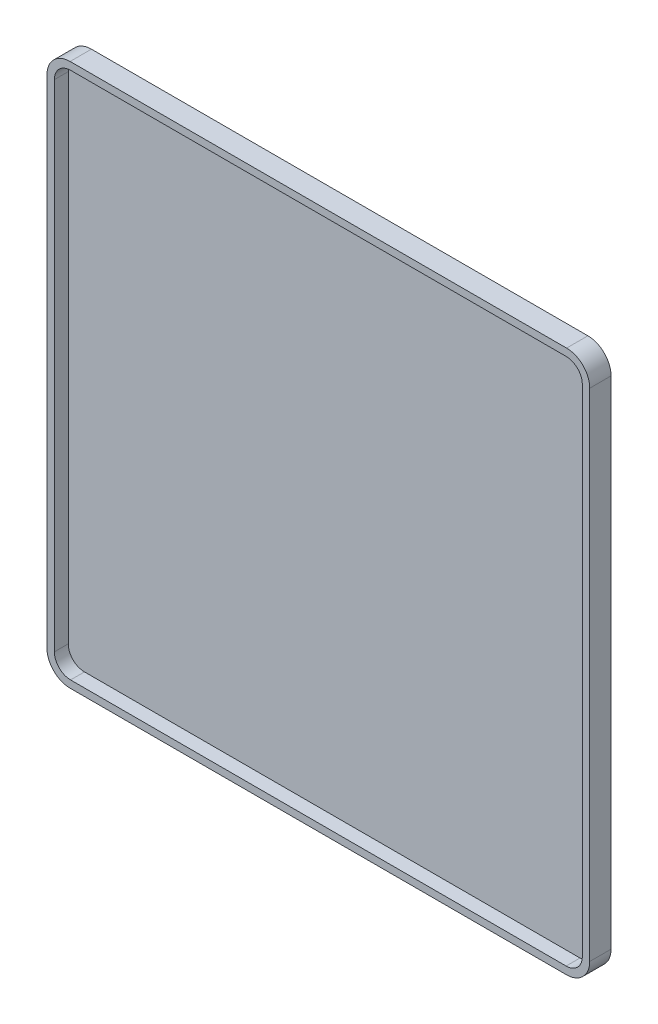
ISO-10303-21;
HEADER;
FILE_DESCRIPTION(('STEP AP214'),'2;1');
FILE_NAME('part.step','',(''),(''),'','','');
FILE_SCHEMA(('AUTOMOTIVE_DESIGN { 1 0 10303 214 1 1 1 1 }'));
ENDSEC;
DATA;
#1=APPLICATION_CONTEXT('core data for automotive mechanical design processes');
#2=APPLICATION_PROTOCOL_DEFINITION('international standard','automotive_design',2000,#1);
#3=PRODUCT_CONTEXT('',#1,'mechanical');
#4=PRODUCT('Part','Part','',(#3));
#5=PRODUCT_RELATED_PRODUCT_CATEGORY('part','',(#4));
#6=PRODUCT_DEFINITION_FORMATION('','',#4);
#7=PRODUCT_DEFINITION_CONTEXT('part definition',#1,'design');
#8=PRODUCT_DEFINITION('design','',#6,#7);
#9=PRODUCT_DEFINITION_SHAPE('','',#8);
#10=(LENGTH_UNIT() NAMED_UNIT(*) SI_UNIT(.MILLI.,.METRE.));
#11=(NAMED_UNIT(*) PLANE_ANGLE_UNIT() SI_UNIT($,.RADIAN.));
#12=(NAMED_UNIT(*) SI_UNIT($,.STERADIAN.) SOLID_ANGLE_UNIT());
#13=UNCERTAINTY_MEASURE_WITH_UNIT(LENGTH_MEASURE(1.E-05),#10,'distance_accuracy_value','');
#14=(GEOMETRIC_REPRESENTATION_CONTEXT(3) GLOBAL_UNCERTAINTY_ASSIGNED_CONTEXT((#13)) GLOBAL_UNIT_ASSIGNED_CONTEXT((#10,
#11,#12)) REPRESENTATION_CONTEXT('',''));
#15=CARTESIAN_POINT('',(0.,0.,0.));
#16=DIRECTION('',(0.,0.,1.));
#17=DIRECTION('',(1.,0.,0.));
#18=AXIS2_PLACEMENT_3D('',#15,#16,#17);
#19=CARTESIAN_POINT('',(-57.,-57.,3.));
#20=DIRECTION('',(0.,0.,-1.));
#21=DIRECTION('',(1.,0.,0.));
#22=AXIS2_PLACEMENT_3D('',#19,#20,#21);
#23=PLANE('',#22);
#24=DIRECTION('',(0.,1.,0.));
#25=VECTOR('',#24,1.);
#26=CARTESIAN_POINT('',(58.6,57.,3.));
#27=LINE('',#26,#25);
#28=CARTESIAN_POINT('',(58.6,-53.6,3.));
#29=VERTEX_POINT('',#28);
#30=CARTESIAN_POINT('',(58.6,53.6,3.));
#31=VERTEX_POINT('',#30);
#32=EDGE_CURVE('E149',#29,#31,#27,.T.);
#33=ORIENTED_EDGE('',*,*,#32,.T.);
#34=CARTESIAN_POINT('',(53.6,53.6,3.));
#35=DIRECTION('',(0.,0.,-1.));
#36=DIRECTION('',(-1.,0.,0.));
#37=AXIS2_PLACEMENT_3D('',#34,#35,#36);
#38=CIRCLE('',#37,5.);
#39=CARTESIAN_POINT('',(53.6,58.6,3.));
#40=VERTEX_POINT('',#39);
#41=EDGE_CURVE('E156',#31,#40,#38,.F.);
#42=ORIENTED_EDGE('',*,*,#41,.T.);
#43=DIRECTION('',(1.,0.,0.));
#44=VECTOR('',#43,1.);
#45=CARTESIAN_POINT('',(-57.,58.6,3.));
#46=LINE('',#45,#44);
#47=CARTESIAN_POINT('',(-53.6,58.6,3.));
#48=VERTEX_POINT('',#47);
#49=EDGE_CURVE('E167',#40,#48,#46,.F.);
#50=ORIENTED_EDGE('',*,*,#49,.T.);
#51=CARTESIAN_POINT('',(-53.6,53.6,3.));
#52=DIRECTION('',(0.,0.,-1.));
#53=DIRECTION('',(-1.,0.,0.));
#54=AXIS2_PLACEMENT_3D('',#51,#52,#53);
#55=CIRCLE('',#54,5.);
#56=CARTESIAN_POINT('',(-58.6,53.6,3.));
#57=VERTEX_POINT('',#56);
#58=EDGE_CURVE('E173',#48,#57,#55,.F.);
#59=ORIENTED_EDGE('',*,*,#58,.T.);
#60=DIRECTION('',(0.,-1.,0.));
#61=VECTOR('',#60,1.);
#62=CARTESIAN_POINT('',(-58.6,57.,3.));
#63=LINE('',#62,#61);
#64=CARTESIAN_POINT('',(-58.6,-53.6,3.));
#65=VERTEX_POINT('',#64);
#66=EDGE_CURVE('E275',#57,#65,#63,.T.);
#67=ORIENTED_EDGE('',*,*,#66,.T.);
#68=CARTESIAN_POINT('',(-53.6,-53.6,3.));
#69=DIRECTION('',(0.,0.,-1.));
#70=DIRECTION('',(-1.,0.,0.));
#71=AXIS2_PLACEMENT_3D('',#68,#69,#70);
#72=CIRCLE('',#71,5.);
#73=CARTESIAN_POINT('',(-53.6,-58.6,3.));
#74=VERTEX_POINT('',#73);
#75=EDGE_CURVE('E157',#65,#74,#72,.F.);
#76=ORIENTED_EDGE('',*,*,#75,.T.);
#77=DIRECTION('',(1.,0.,0.));
#78=VECTOR('',#77,1.);
#79=CARTESIAN_POINT('',(-57.,-58.6,3.));
#80=LINE('',#79,#78);
#81=CARTESIAN_POINT('',(53.6,-58.6,3.));
#82=VERTEX_POINT('',#81);
#83=EDGE_CURVE('E151',#74,#82,#80,.T.);
#84=ORIENTED_EDGE('',*,*,#83,.T.);
#85=CARTESIAN_POINT('',(53.6,-53.6,3.));
#86=DIRECTION('',(0.,0.,-1.));
#87=DIRECTION('',(-1.,0.,0.));
#88=AXIS2_PLACEMENT_3D('',#85,#86,#87);
#89=CIRCLE('',#88,5.);
#90=EDGE_CURVE('E147',#82,#29,#89,.F.);
#91=ORIENTED_EDGE('',*,*,#90,.T.);
#92=EDGE_LOOP('',(#33,#42,#50,#59,#67,#76,#84,#91));
#93=FACE_BOUND('',#92,.T.);
#94=DIRECTION('',(1.,0.,0.));
#95=VECTOR('',#94,1.);
#96=CARTESIAN_POINT('',(-57.,-57.,3.));
#97=LINE('',#96,#95);
#98=CARTESIAN_POINT('',(-53.5,-57.,3.));
#99=VERTEX_POINT('',#98);
#100=CARTESIAN_POINT('',(53.5,-57.,3.));
#101=VERTEX_POINT('',#100);
#102=EDGE_CURVE('E261',#99,#101,#97,.T.);
#103=ORIENTED_EDGE('',*,*,#102,.F.);
#104=CARTESIAN_POINT('',(-53.5,-53.5,3.));
#105=DIRECTION('',(0.,0.,-1.));
#106=DIRECTION('',(-1.,0.,0.));
#107=AXIS2_PLACEMENT_3D('',#104,#105,#106);
#108=CIRCLE('',#107,3.5);
#109=CARTESIAN_POINT('',(-57.,-53.5,3.));
#110=VERTEX_POINT('',#109);
#111=EDGE_CURVE('E232',#99,#110,#108,.T.);
#112=ORIENTED_EDGE('',*,*,#111,.T.);
#113=DIRECTION('',(0.,-1.,0.));
#114=VECTOR('',#113,1.);
#115=CARTESIAN_POINT('',(-57.,57.,3.));
#116=LINE('',#115,#114);
#117=CARTESIAN_POINT('',(-57.,53.5,3.));
#118=VERTEX_POINT('',#117);
#119=EDGE_CURVE('E266',#118,#110,#116,.T.);
#120=ORIENTED_EDGE('',*,*,#119,.F.);
#121=CARTESIAN_POINT('',(-53.5,53.5,3.));
#122=DIRECTION('',(0.,0.,-1.));
#123=DIRECTION('',(-1.,0.,0.));
#124=AXIS2_PLACEMENT_3D('',#121,#122,#123);
#125=CIRCLE('',#124,3.5);
#126=CARTESIAN_POINT('',(-53.5,57.,3.));
#127=VERTEX_POINT('',#126);
#128=EDGE_CURVE('E11',#118,#127,#125,.T.);
#129=ORIENTED_EDGE('',*,*,#128,.T.);
#130=DIRECTION('',(-1.,0.,0.));
#131=VECTOR('',#130,1.);
#132=CARTESIAN_POINT('',(-57.,57.,3.));
#133=LINE('',#132,#131);
#134=CARTESIAN_POINT('',(53.5,57.,3.));
#135=VERTEX_POINT('',#134);
#136=EDGE_CURVE('E236',#135,#127,#133,.T.);
#137=ORIENTED_EDGE('',*,*,#136,.F.);
#138=CARTESIAN_POINT('',(53.5,53.5,3.));
#139=DIRECTION('',(0.,0.,-1.));
#140=DIRECTION('',(-1.,0.,0.));
#141=AXIS2_PLACEMENT_3D('',#138,#139,#140);
#142=CIRCLE('',#141,3.5);
#143=CARTESIAN_POINT('',(57.,53.5,3.));
#144=VERTEX_POINT('',#143);
#145=EDGE_CURVE('E43',#135,#144,#142,.T.);
#146=ORIENTED_EDGE('',*,*,#145,.T.);
#147=DIRECTION('',(0.,1.,0.));
#148=VECTOR('',#147,1.);
#149=CARTESIAN_POINT('',(57.,57.,3.));
#150=LINE('',#149,#148);
#151=CARTESIAN_POINT('',(57.,-53.5,3.));
#152=VERTEX_POINT('',#151);
#153=EDGE_CURVE('E176',#152,#144,#150,.T.);
#154=ORIENTED_EDGE('',*,*,#153,.F.);
#155=CARTESIAN_POINT('',(53.5,-53.5,3.));
#156=DIRECTION('',(0.,0.,-1.));
#157=DIRECTION('',(-1.,0.,0.));
#158=AXIS2_PLACEMENT_3D('',#155,#156,#157);
#159=CIRCLE('',#158,3.5);
#160=EDGE_CURVE('E230',#152,#101,#159,.T.);
#161=ORIENTED_EDGE('',*,*,#160,.T.);
#162=EDGE_LOOP('',(#103,#112,#120,#129,#137,#146,#154,#161));
#163=FACE_BOUND('',#162,.T.);
#164=ADVANCED_FACE('F35',(#93,#163),#23,.F.);
#165=CARTESIAN_POINT('',(58.6,57.,0.));
#166=DIRECTION('',(1.,0.,0.));
#167=DIRECTION('',(0.,0.,-1.));
#168=AXIS2_PLACEMENT_3D('',#165,#166,#167);
#169=PLANE('',#168);
#170=DIRECTION('',(0.,1.,0.));
#171=VECTOR('',#170,1.);
#172=CARTESIAN_POINT('',(58.6,0.,-1.6));
#173=LINE('',#172,#171);
#174=CARTESIAN_POINT('',(58.6,-53.6,-1.6));
#175=VERTEX_POINT('',#174);
#176=CARTESIAN_POINT('',(58.6,53.6,-1.6));
#177=VERTEX_POINT('',#176);
#178=EDGE_CURVE('E285',#175,#177,#173,.T.);
#179=ORIENTED_EDGE('',*,*,#178,.T.);
#180=DIRECTION('',(0.,0.,1.));
#181=VECTOR('',#180,1.);
#182=CARTESIAN_POINT('',(58.6,53.6,0.));
#183=LINE('',#182,#181);
#184=EDGE_CURVE('E166',#177,#31,#183,.T.);
#185=ORIENTED_EDGE('',*,*,#184,.T.);
#186=ORIENTED_EDGE('',*,*,#32,.F.);
#187=DIRECTION('',(0.,0.,1.));
#188=VECTOR('',#187,1.);
#189=CARTESIAN_POINT('',(58.6,-53.6,0.));
#190=LINE('',#189,#188);
#191=EDGE_CURVE('E163',#29,#175,#190,.F.);
#192=ORIENTED_EDGE('',*,*,#191,.T.);
#193=EDGE_LOOP('',(#179,#185,#186,#192));
#194=FACE_BOUND('',#193,.T.);
#195=ADVANCED_FACE('F162',(#194),#169,.T.);
#196=CARTESIAN_POINT('',(-57.,58.6,0.));
#197=DIRECTION('',(0.,1.,0.));
#198=DIRECTION('',(0.,0.,1.));
#199=AXIS2_PLACEMENT_3D('',#196,#197,#198);
#200=PLANE('',#199);
#201=ORIENTED_EDGE('',*,*,#49,.F.);
#202=DIRECTION('',(0.,0.,1.));
#203=VECTOR('',#202,1.);
#204=CARTESIAN_POINT('',(53.6,58.6,0.));
#205=LINE('',#204,#203);
#206=CARTESIAN_POINT('',(53.6,58.6,-1.6));
#207=VERTEX_POINT('',#206);
#208=EDGE_CURVE('E185',#40,#207,#205,.F.);
#209=ORIENTED_EDGE('',*,*,#208,.T.);
#210=DIRECTION('',(1.,0.,0.));
#211=VECTOR('',#210,1.);
#212=CARTESIAN_POINT('',(0.,58.6,-1.6));
#213=LINE('',#212,#211);
#214=CARTESIAN_POINT('',(-53.6,58.6,-1.6));
#215=VERTEX_POINT('',#214);
#216=EDGE_CURVE('E282',#207,#215,#213,.F.);
#217=ORIENTED_EDGE('',*,*,#216,.T.);
#218=DIRECTION('',(0.,0.,1.));
#219=VECTOR('',#218,1.);
#220=CARTESIAN_POINT('',(-53.6,58.6,0.));
#221=LINE('',#220,#219);
#222=EDGE_CURVE('E182',#215,#48,#221,.T.);
#223=ORIENTED_EDGE('',*,*,#222,.T.);
#224=EDGE_LOOP('',(#201,#209,#217,#223));
#225=FACE_BOUND('',#224,.T.);
#226=ADVANCED_FACE('F311',(#225),#200,.T.);
#227=CARTESIAN_POINT('',(-58.6,57.,0.));
#228=DIRECTION('',(-1.,0.,0.));
#229=DIRECTION('',(0.,-1.,0.));
#230=AXIS2_PLACEMENT_3D('',#227,#228,#229);
#231=PLANE('',#230);
#232=DIRECTION('',(0.,1.,0.));
#233=VECTOR('',#232,1.);
#234=CARTESIAN_POINT('',(-58.6,0.,-1.6));
#235=LINE('',#234,#233);
#236=CARTESIAN_POINT('',(-58.6,53.6,-1.6));
#237=VERTEX_POINT('',#236);
#238=CARTESIAN_POINT('',(-58.6,-53.6,-1.6));
#239=VERTEX_POINT('',#238);
#240=EDGE_CURVE('E265',#237,#239,#235,.F.);
#241=ORIENTED_EDGE('',*,*,#240,.T.);
#242=DIRECTION('',(0.,0.,1.));
#243=VECTOR('',#242,1.);
#244=CARTESIAN_POINT('',(-58.6,-53.6,0.));
#245=LINE('',#244,#243);
#246=EDGE_CURVE('E200',#239,#65,#245,.T.);
#247=ORIENTED_EDGE('',*,*,#246,.T.);
#248=ORIENTED_EDGE('',*,*,#66,.F.);
#249=DIRECTION('',(0.,0.,1.));
#250=VECTOR('',#249,1.);
#251=CARTESIAN_POINT('',(-58.6,53.6,0.));
#252=LINE('',#251,#250);
#253=EDGE_CURVE('E198',#57,#237,#252,.F.);
#254=ORIENTED_EDGE('',*,*,#253,.T.);
#255=EDGE_LOOP('',(#241,#247,#248,#254));
#256=FACE_BOUND('',#255,.T.);
#257=ADVANCED_FACE('F303',(#256),#231,.T.);
#258=CARTESIAN_POINT('',(-57.,-58.6,0.));
#259=DIRECTION('',(0.,-1.,0.));
#260=DIRECTION('',(0.,0.,-1.));
#261=AXIS2_PLACEMENT_3D('',#258,#259,#260);
#262=PLANE('',#261);
#263=DIRECTION('',(1.,0.,0.));
#264=VECTOR('',#263,1.);
#265=CARTESIAN_POINT('',(0.,-58.6,-1.6));
#266=LINE('',#265,#264);
#267=CARTESIAN_POINT('',(-53.6,-58.6,-1.6));
#268=VERTEX_POINT('',#267);
#269=CARTESIAN_POINT('',(53.6,-58.6,-1.6));
#270=VERTEX_POINT('',#269);
#271=EDGE_CURVE('E287',#268,#270,#266,.T.);
#272=ORIENTED_EDGE('',*,*,#271,.T.);
#273=DIRECTION('',(0.,0.,1.));
#274=VECTOR('',#273,1.);
#275=CARTESIAN_POINT('',(53.6,-58.6,0.));
#276=LINE('',#275,#274);
#277=EDGE_CURVE('E196',#270,#82,#276,.T.);
#278=ORIENTED_EDGE('',*,*,#277,.T.);
#279=ORIENTED_EDGE('',*,*,#83,.F.);
#280=DIRECTION('',(0.,0.,1.));
#281=VECTOR('',#280,1.);
#282=CARTESIAN_POINT('',(-53.6,-58.6,0.));
#283=LINE('',#282,#281);
#284=EDGE_CURVE('E194',#74,#268,#283,.F.);
#285=ORIENTED_EDGE('',*,*,#284,.T.);
#286=EDGE_LOOP('',(#272,#278,#279,#285));
#287=FACE_BOUND('',#286,.T.);
#288=ADVANCED_FACE('F291',(#287),#262,.T.);
#289=CARTESIAN_POINT('',(57.,57.,0.));
#290=DIRECTION('',(1.,0.,0.));
#291=DIRECTION('',(0.,0.,-1.));
#292=AXIS2_PLACEMENT_3D('',#289,#290,#291);
#293=PLANE('',#292);
#294=DIRECTION('',(0.,1.,0.));
#295=VECTOR('',#294,1.);
#296=CARTESIAN_POINT('',(57.,57.,0.));
#297=LINE('',#296,#295);
#298=CARTESIAN_POINT('',(57.,-53.5,0.));
#299=VERTEX_POINT('',#298);
#300=CARTESIAN_POINT('',(57.,53.5,0.));
#301=VERTEX_POINT('',#300);
#302=EDGE_CURVE('E242',#299,#301,#297,.T.);
#303=ORIENTED_EDGE('',*,*,#302,.F.);
#304=DIRECTION('',(0.,0.,1.));
#305=VECTOR('',#304,1.);
#306=CARTESIAN_POINT('',(57.,-53.5,3.));
#307=LINE('',#306,#305);
#308=EDGE_CURVE('E205',#299,#152,#307,.T.);
#309=ORIENTED_EDGE('',*,*,#308,.T.);
#310=ORIENTED_EDGE('',*,*,#153,.T.);
#311=DIRECTION('',(0.,0.,1.));
#312=VECTOR('',#311,1.);
#313=CARTESIAN_POINT('',(57.,53.5,0.));
#314=LINE('',#313,#312);
#315=EDGE_CURVE('E203',#144,#301,#314,.F.);
#316=ORIENTED_EDGE('',*,*,#315,.T.);
#317=EDGE_LOOP('',(#303,#309,#310,#316));
#318=FACE_BOUND('',#317,.T.);
#319=ADVANCED_FACE('F239',(#318),#293,.F.);
#320=CARTESIAN_POINT('',(-57.,57.,0.));
#321=DIRECTION('',(0.,1.,0.));
#322=DIRECTION('',(0.,0.,1.));
#323=AXIS2_PLACEMENT_3D('',#320,#321,#322);
#324=PLANE('',#323);
#325=DIRECTION('',(-1.,0.,0.));
#326=VECTOR('',#325,1.);
#327=CARTESIAN_POINT('',(-57.,57.,0.));
#328=LINE('',#327,#326);
#329=CARTESIAN_POINT('',(53.5,57.,0.));
#330=VERTEX_POINT('',#329);
#331=CARTESIAN_POINT('',(-53.5,57.,0.));
#332=VERTEX_POINT('',#331);
#333=EDGE_CURVE('E243',#330,#332,#328,.T.);
#334=ORIENTED_EDGE('',*,*,#333,.F.);
#335=DIRECTION('',(0.,0.,1.));
#336=VECTOR('',#335,1.);
#337=CARTESIAN_POINT('',(53.5,57.,3.));
#338=LINE('',#337,#336);
#339=EDGE_CURVE('E228',#330,#135,#338,.T.);
#340=ORIENTED_EDGE('',*,*,#339,.T.);
#341=ORIENTED_EDGE('',*,*,#136,.T.);
#342=DIRECTION('',(0.,0.,1.));
#343=VECTOR('',#342,1.);
#344=CARTESIAN_POINT('',(-53.5,57.,0.));
#345=LINE('',#344,#343);
#346=EDGE_CURVE('E226',#127,#332,#345,.F.);
#347=ORIENTED_EDGE('',*,*,#346,.T.);
#348=EDGE_LOOP('',(#334,#340,#341,#347));
#349=FACE_BOUND('',#348,.T.);
#350=ADVANCED_FACE('F253',(#349),#324,.F.);
#351=CARTESIAN_POINT('',(-57.,57.,0.));
#352=DIRECTION('',(-1.,0.,0.));
#353=DIRECTION('',(0.,-1.,0.));
#354=AXIS2_PLACEMENT_3D('',#351,#352,#353);
#355=PLANE('',#354);
#356=ORIENTED_EDGE('',*,*,#119,.T.);
#357=DIRECTION('',(0.,0.,1.));
#358=VECTOR('',#357,1.);
#359=CARTESIAN_POINT('',(-57.,-53.5,0.));
#360=LINE('',#359,#358);
#361=CARTESIAN_POINT('',(-57.,-53.5,0.));
#362=VERTEX_POINT('',#361);
#363=EDGE_CURVE('E224',#110,#362,#360,.F.);
#364=ORIENTED_EDGE('',*,*,#363,.T.);
#365=DIRECTION('',(0.,-1.,0.));
#366=VECTOR('',#365,1.);
#367=CARTESIAN_POINT('',(-57.,57.,0.));
#368=LINE('',#367,#366);
#369=CARTESIAN_POINT('',(-57.,53.5,0.));
#370=VERTEX_POINT('',#369);
#371=EDGE_CURVE('E256',#370,#362,#368,.T.);
#372=ORIENTED_EDGE('',*,*,#371,.F.);
#373=DIRECTION('',(0.,0.,1.));
#374=VECTOR('',#373,1.);
#375=CARTESIAN_POINT('',(-57.,53.5,3.));
#376=LINE('',#375,#374);
#377=EDGE_CURVE('E221',#370,#118,#376,.T.);
#378=ORIENTED_EDGE('',*,*,#377,.T.);
#379=EDGE_LOOP('',(#356,#364,#372,#378));
#380=FACE_BOUND('',#379,.T.);
#381=ADVANCED_FACE('F335',(#380),#355,.F.);
#382=CARTESIAN_POINT('',(-57.,-57.,0.));
#383=DIRECTION('',(0.,-1.,0.));
#384=DIRECTION('',(0.,0.,-1.));
#385=AXIS2_PLACEMENT_3D('',#382,#383,#384);
#386=PLANE('',#385);
#387=ORIENTED_EDGE('',*,*,#102,.T.);
#388=DIRECTION('',(0.,0.,1.));
#389=VECTOR('',#388,1.);
#390=CARTESIAN_POINT('',(53.5,-57.,0.));
#391=LINE('',#390,#389);
#392=CARTESIAN_POINT('',(53.5,-57.,0.));
#393=VERTEX_POINT('',#392);
#394=EDGE_CURVE('E211',#101,#393,#391,.F.);
#395=ORIENTED_EDGE('',*,*,#394,.T.);
#396=DIRECTION('',(1.,0.,0.));
#397=VECTOR('',#396,1.);
#398=CARTESIAN_POINT('',(-57.,-57.,0.));
#399=LINE('',#398,#397);
#400=CARTESIAN_POINT('',(-53.5,-57.,0.));
#401=VERTEX_POINT('',#400);
#402=EDGE_CURVE('E264',#401,#393,#399,.T.);
#403=ORIENTED_EDGE('',*,*,#402,.F.);
#404=DIRECTION('',(0.,0.,1.));
#405=VECTOR('',#404,1.);
#406=CARTESIAN_POINT('',(-53.5,-57.,3.));
#407=LINE('',#406,#405);
#408=EDGE_CURVE('E208',#401,#99,#407,.T.);
#409=ORIENTED_EDGE('',*,*,#408,.T.);
#410=EDGE_LOOP('',(#387,#395,#403,#409));
#411=FACE_BOUND('',#410,.T.);
#412=ADVANCED_FACE('F338',(#411),#386,.F.);
#413=CARTESIAN_POINT('',(0.,0.,0.));
#414=DIRECTION('',(0.,0.,1.));
#415=DIRECTION('',(1.,0.,0.));
#416=AXIS2_PLACEMENT_3D('',#413,#414,#415);
#417=PLANE('',#416);
#418=ORIENTED_EDGE('',*,*,#402,.T.);
#419=CARTESIAN_POINT('',(53.5,-53.5,0.));
#420=DIRECTION('',(0.,0.,1.));
#421=DIRECTION('',(1.,0.,0.));
#422=AXIS2_PLACEMENT_3D('',#419,#420,#421);
#423=CIRCLE('',#422,3.5);
#424=EDGE_CURVE('E219',#393,#299,#423,.T.);
#425=ORIENTED_EDGE('',*,*,#424,.T.);
#426=ORIENTED_EDGE('',*,*,#302,.T.);
#427=CARTESIAN_POINT('',(53.5,53.5,0.));
#428=DIRECTION('',(0.,0.,1.));
#429=DIRECTION('',(1.,0.,0.));
#430=AXIS2_PLACEMENT_3D('',#427,#428,#429);
#431=CIRCLE('',#430,3.5);
#432=EDGE_CURVE('E215',#301,#330,#431,.T.);
#433=ORIENTED_EDGE('',*,*,#432,.T.);
#434=ORIENTED_EDGE('',*,*,#333,.T.);
#435=CARTESIAN_POINT('',(-53.5,53.5,0.));
#436=DIRECTION('',(0.,0.,1.));
#437=DIRECTION('',(1.,0.,0.));
#438=AXIS2_PLACEMENT_3D('',#435,#436,#437);
#439=CIRCLE('',#438,3.5);
#440=EDGE_CURVE('E213',#332,#370,#439,.T.);
#441=ORIENTED_EDGE('',*,*,#440,.T.);
#442=ORIENTED_EDGE('',*,*,#371,.T.);
#443=CARTESIAN_POINT('',(-53.5,-53.5,0.));
#444=DIRECTION('',(0.,0.,1.));
#445=DIRECTION('',(1.,0.,0.));
#446=AXIS2_PLACEMENT_3D('',#443,#444,#445);
#447=CIRCLE('',#446,3.5);
#448=EDGE_CURVE('E217',#362,#401,#447,.T.);
#449=ORIENTED_EDGE('',*,*,#448,.T.);
#450=EDGE_LOOP('',(#418,#425,#426,#433,#434,#441,#442,#449));
#451=FACE_BOUND('',#450,.T.);
#452=ADVANCED_FACE('F250',(#451),#417,.T.);
#453=CARTESIAN_POINT('',(0.,0.,-1.6));
#454=DIRECTION('',(0.,0.,1.));
#455=DIRECTION('',(1.,0.,0.));
#456=AXIS2_PLACEMENT_3D('',#453,#454,#455);
#457=PLANE('',#456);
#458=ORIENTED_EDGE('',*,*,#216,.F.);
#459=CARTESIAN_POINT('',(53.6,53.6,-1.6));
#460=DIRECTION('',(0.,0.,1.));
#461=DIRECTION('',(1.,0.,0.));
#462=AXIS2_PLACEMENT_3D('',#459,#460,#461);
#463=CIRCLE('',#462,5.);
#464=EDGE_CURVE('E192',#207,#177,#463,.F.);
#465=ORIENTED_EDGE('',*,*,#464,.T.);
#466=ORIENTED_EDGE('',*,*,#178,.F.);
#467=CARTESIAN_POINT('',(53.6,-53.6,-1.6));
#468=DIRECTION('',(0.,0.,1.));
#469=DIRECTION('',(1.,0.,0.));
#470=AXIS2_PLACEMENT_3D('',#467,#468,#469);
#471=CIRCLE('',#470,5.);
#472=EDGE_CURVE('E171',#175,#270,#471,.F.);
#473=ORIENTED_EDGE('',*,*,#472,.T.);
#474=ORIENTED_EDGE('',*,*,#271,.F.);
#475=CARTESIAN_POINT('',(-53.6,-53.6,-1.6));
#476=DIRECTION('',(0.,0.,1.));
#477=DIRECTION('',(1.,0.,0.));
#478=AXIS2_PLACEMENT_3D('',#475,#476,#477);
#479=CIRCLE('',#478,5.);
#480=EDGE_CURVE('E189',#268,#239,#479,.F.);
#481=ORIENTED_EDGE('',*,*,#480,.T.);
#482=ORIENTED_EDGE('',*,*,#240,.F.);
#483=CARTESIAN_POINT('',(-53.6,53.6,-1.6));
#484=DIRECTION('',(0.,0.,1.));
#485=DIRECTION('',(1.,0.,0.));
#486=AXIS2_PLACEMENT_3D('',#483,#484,#485);
#487=CIRCLE('',#486,5.);
#488=EDGE_CURVE('E187',#237,#215,#487,.F.);
#489=ORIENTED_EDGE('',*,*,#488,.T.);
#490=EDGE_LOOP('',(#458,#465,#466,#473,#474,#481,#482,#489));
#491=FACE_BOUND('',#490,.T.);
#492=ADVANCED_FACE('F296',(#491),#457,.F.);
#493=CARTESIAN_POINT('',(53.6,53.6,0.));
#494=DIRECTION('',(0.,0.,1.));
#495=DIRECTION('',(1.,0.,0.));
#496=AXIS2_PLACEMENT_3D('',#493,#494,#495);
#497=CYLINDRICAL_SURFACE('',#496,5.);
#498=ORIENTED_EDGE('',*,*,#464,.F.);
#499=ORIENTED_EDGE('',*,*,#208,.F.);
#500=ORIENTED_EDGE('',*,*,#41,.F.);
#501=ORIENTED_EDGE('',*,*,#184,.F.);
#502=EDGE_LOOP('',(#498,#499,#500,#501));
#503=FACE_BOUND('',#502,.T.);
#504=ADVANCED_FACE('F315',(#503),#497,.T.);
#505=CARTESIAN_POINT('',(53.6,-53.6,0.));
#506=DIRECTION('',(0.,0.,1.));
#507=DIRECTION('',(1.,0.,0.));
#508=AXIS2_PLACEMENT_3D('',#505,#506,#507);
#509=CYLINDRICAL_SURFACE('',#508,5.);
#510=ORIENTED_EDGE('',*,*,#472,.F.);
#511=ORIENTED_EDGE('',*,*,#191,.F.);
#512=ORIENTED_EDGE('',*,*,#90,.F.);
#513=ORIENTED_EDGE('',*,*,#277,.F.);
#514=EDGE_LOOP('',(#510,#511,#512,#513));
#515=FACE_BOUND('',#514,.T.);
#516=ADVANCED_FACE('F170',(#515),#509,.T.);
#517=CARTESIAN_POINT('',(-53.6,-53.6,0.));
#518=DIRECTION('',(0.,0.,1.));
#519=DIRECTION('',(1.,0.,0.));
#520=AXIS2_PLACEMENT_3D('',#517,#518,#519);
#521=CYLINDRICAL_SURFACE('',#520,5.);
#522=ORIENTED_EDGE('',*,*,#480,.F.);
#523=ORIENTED_EDGE('',*,*,#284,.F.);
#524=ORIENTED_EDGE('',*,*,#75,.F.);
#525=ORIENTED_EDGE('',*,*,#246,.F.);
#526=EDGE_LOOP('',(#522,#523,#524,#525));
#527=FACE_BOUND('',#526,.T.);
#528=ADVANCED_FACE('F300',(#527),#521,.T.);
#529=CARTESIAN_POINT('',(-53.6,53.6,0.));
#530=DIRECTION('',(0.,0.,1.));
#531=DIRECTION('',(1.,0.,0.));
#532=AXIS2_PLACEMENT_3D('',#529,#530,#531);
#533=CYLINDRICAL_SURFACE('',#532,5.);
#534=ORIENTED_EDGE('',*,*,#488,.F.);
#535=ORIENTED_EDGE('',*,*,#253,.F.);
#536=ORIENTED_EDGE('',*,*,#58,.F.);
#537=ORIENTED_EDGE('',*,*,#222,.F.);
#538=EDGE_LOOP('',(#534,#535,#536,#537));
#539=FACE_BOUND('',#538,.T.);
#540=ADVANCED_FACE('F309',(#539),#533,.T.);
#541=CARTESIAN_POINT('',(53.5,-53.5,0.));
#542=DIRECTION('',(0.,0.,-1.));
#543=DIRECTION('',(-1.,0.,0.));
#544=AXIS2_PLACEMENT_3D('',#541,#542,#543);
#545=CYLINDRICAL_SURFACE('',#544,3.5);
#546=ORIENTED_EDGE('',*,*,#424,.F.);
#547=ORIENTED_EDGE('',*,*,#394,.F.);
#548=ORIENTED_EDGE('',*,*,#160,.F.);
#549=ORIENTED_EDGE('',*,*,#308,.F.);
#550=EDGE_LOOP('',(#546,#547,#548,#549));
#551=FACE_BOUND('',#550,.T.);
#552=ADVANCED_FACE('F388',(#551),#545,.F.);
#553=CARTESIAN_POINT('',(-53.5,-53.5,0.));
#554=DIRECTION('',(0.,0.,-1.));
#555=DIRECTION('',(-1.,0.,0.));
#556=AXIS2_PLACEMENT_3D('',#553,#554,#555);
#557=CYLINDRICAL_SURFACE('',#556,3.5);
#558=ORIENTED_EDGE('',*,*,#448,.F.);
#559=ORIENTED_EDGE('',*,*,#363,.F.);
#560=ORIENTED_EDGE('',*,*,#111,.F.);
#561=ORIENTED_EDGE('',*,*,#408,.F.);
#562=EDGE_LOOP('',(#558,#559,#560,#561));
#563=FACE_BOUND('',#562,.T.);
#564=ADVANCED_FACE('F466',(#563),#557,.F.);
#565=CARTESIAN_POINT('',(53.5,53.5,0.));
#566=DIRECTION('',(0.,0.,-1.));
#567=DIRECTION('',(-1.,0.,0.));
#568=AXIS2_PLACEMENT_3D('',#565,#566,#567);
#569=CYLINDRICAL_SURFACE('',#568,3.5);
#570=ORIENTED_EDGE('',*,*,#432,.F.);
#571=ORIENTED_EDGE('',*,*,#315,.F.);
#572=ORIENTED_EDGE('',*,*,#145,.F.);
#573=ORIENTED_EDGE('',*,*,#339,.F.);
#574=EDGE_LOOP('',(#570,#571,#572,#573));
#575=FACE_BOUND('',#574,.T.);
#576=ADVANCED_FACE('F245',(#575),#569,.F.);
#577=CARTESIAN_POINT('',(-53.5,53.5,0.));
#578=DIRECTION('',(0.,0.,-1.));
#579=DIRECTION('',(-1.,0.,0.));
#580=AXIS2_PLACEMENT_3D('',#577,#578,#579);
#581=CYLINDRICAL_SURFACE('',#580,3.5);
#582=ORIENTED_EDGE('',*,*,#440,.F.);
#583=ORIENTED_EDGE('',*,*,#346,.F.);
#584=ORIENTED_EDGE('',*,*,#128,.F.);
#585=ORIENTED_EDGE('',*,*,#377,.F.);
#586=EDGE_LOOP('',(#582,#583,#584,#585));
#587=FACE_BOUND('',#586,.T.);
#588=ADVANCED_FACE('F37',(#587),#581,.F.);
#589=CLOSED_SHELL('',(#164,#195,#226,#257,#288,#319,#350,#381,#412,#452,#492,#504,#516,#528,
#540,#552,#564,#576,#588));
#590=MANIFOLD_SOLID_BREP('B2',#589);
#591=ADVANCED_BREP_SHAPE_REPRESENTATION('',(#18,#590),#14);
#592=SHAPE_DEFINITION_REPRESENTATION(#9,#591);
ENDSEC;
END-ISO-10303-21;
